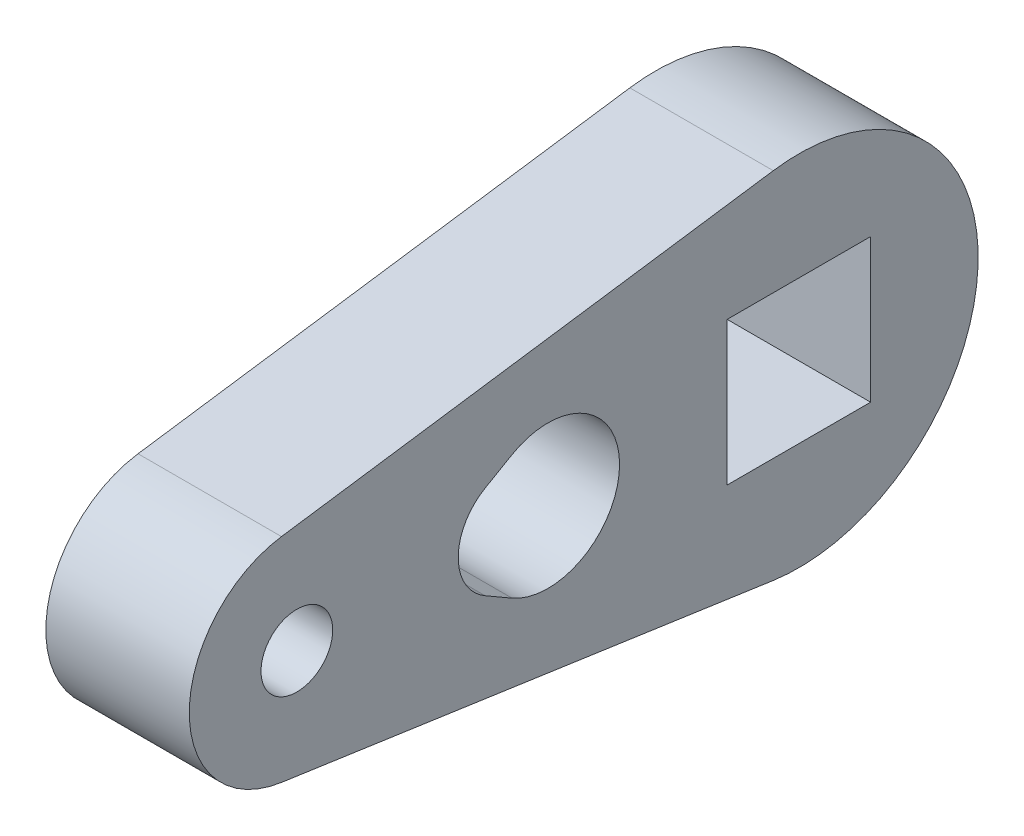
ISO-10303-21;
HEADER;
FILE_DESCRIPTION(('STEP AP214'),'2;1');
FILE_NAME('part.step','',(''),(''),'','','');
FILE_SCHEMA(('AUTOMOTIVE_DESIGN { 1 0 10303 214 1 1 1 1 }'));
ENDSEC;
DATA;
#1=APPLICATION_CONTEXT('core data for automotive mechanical design processes');
#2=APPLICATION_PROTOCOL_DEFINITION('international standard','automotive_design',2000,#1);
#3=PRODUCT_CONTEXT('',#1,'mechanical');
#4=PRODUCT('Part','Part','',(#3));
#5=PRODUCT_RELATED_PRODUCT_CATEGORY('part','',(#4));
#6=PRODUCT_DEFINITION_FORMATION('','',#4);
#7=PRODUCT_DEFINITION_CONTEXT('part definition',#1,'design');
#8=PRODUCT_DEFINITION('design','',#6,#7);
#9=PRODUCT_DEFINITION_SHAPE('','',#8);
#10=(LENGTH_UNIT() NAMED_UNIT(*) SI_UNIT(.MILLI.,.METRE.));
#11=(NAMED_UNIT(*) PLANE_ANGLE_UNIT() SI_UNIT($,.RADIAN.));
#12=(NAMED_UNIT(*) SI_UNIT($,.STERADIAN.) SOLID_ANGLE_UNIT());
#13=UNCERTAINTY_MEASURE_WITH_UNIT(LENGTH_MEASURE(1.E-05),#10,'distance_accuracy_value','');
#14=(GEOMETRIC_REPRESENTATION_CONTEXT(3) GLOBAL_UNCERTAINTY_ASSIGNED_CONTEXT((#13)) GLOBAL_UNIT_ASSIGNED_CONTEXT((#10,
#11,#12)) REPRESENTATION_CONTEXT('',''));
#15=CARTESIAN_POINT('',(0.,0.,0.));
#16=DIRECTION('',(0.,0.,1.));
#17=DIRECTION('',(1.,0.,0.));
#18=AXIS2_PLACEMENT_3D('',#15,#16,#17);
#19=CARTESIAN_POINT('',(4.,0.,28.));
#20=DIRECTION('',(1.,0.,0.));
#21=DIRECTION('',(0.,0.,-1.));
#22=AXIS2_PLACEMENT_3D('',#19,#20,#21);
#23=PLANE('',#22);
#24=DIRECTION('',(0.,-0.500000000000002,-0.866025403784437));
#25=VECTOR('',#24,1.);
#26=CARTESIAN_POINT('',(4.,-2.59807621135331,17.5));
#27=LINE('',#26,#25);
#28=CARTESIAN_POINT('',(4.,-2.59807621135331,17.5));
#29=VERTEX_POINT('',#28);
#30=CARTESIAN_POINT('',(4.,-3.46410161513776,16.));
#31=VERTEX_POINT('',#30);
#32=EDGE_CURVE('E131',#29,#31,#27,.T.);
#33=ORIENTED_EDGE('',*,*,#32,.F.);
#34=CARTESIAN_POINT('',(4.,0.,16.));
#35=DIRECTION('',(1.,0.,0.));
#36=DIRECTION('',(0.,0.,-1.));
#37=AXIS2_PLACEMENT_3D('',#34,#35,#36);
#38=CIRCLE('',#37,3.);
#39=CARTESIAN_POINT('',(4.,2.59807621135331,17.5));
#40=VERTEX_POINT('',#39);
#41=EDGE_CURVE('E123',#40,#29,#38,.T.);
#42=ORIENTED_EDGE('',*,*,#41,.F.);
#43=DIRECTION('',(0.,-0.500000000000002,0.866025403784437));
#44=VECTOR('',#43,1.);
#45=CARTESIAN_POINT('',(4.,2.59807621135331,17.5));
#46=LINE('',#45,#44);
#47=CARTESIAN_POINT('',(4.,3.46410161513776,16.));
#48=VERTEX_POINT('',#47);
#49=EDGE_CURVE('E146',#48,#40,#46,.T.);
#50=ORIENTED_EDGE('',*,*,#49,.F.);
#51=CARTESIAN_POINT('',(4.,0.,14.));
#52=DIRECTION('',(1.,0.,0.));
#53=DIRECTION('',(0.,0.,-1.));
#54=AXIS2_PLACEMENT_3D('',#51,#52,#53);
#55=CIRCLE('',#54,4.);
#56=EDGE_CURVE('E144',#31,#48,#55,.T.);
#57=ORIENTED_EDGE('',*,*,#56,.F.);
#58=EDGE_LOOP('',(#33,#42,#50,#57));
#59=FACE_BOUND('',#58,.T.);
#60=DIRECTION('',(0.,0.,-1.));
#61=VECTOR('',#60,1.);
#62=CARTESIAN_POINT('',(4.,-4.,4.));
#63=LINE('',#62,#61);
#64=CARTESIAN_POINT('',(4.,-4.,4.));
#65=VERTEX_POINT('',#64);
#66=CARTESIAN_POINT('',(4.,-4.,-4.));
#67=VERTEX_POINT('',#66);
#68=EDGE_CURVE('E164',#65,#67,#63,.T.);
#69=ORIENTED_EDGE('',*,*,#68,.F.);
#70=DIRECTION('',(0.,-1.,0.));
#71=VECTOR('',#70,1.);
#72=CARTESIAN_POINT('',(4.,4.,4.));
#73=LINE('',#72,#71);
#74=CARTESIAN_POINT('',(4.,4.,4.));
#75=VERTEX_POINT('',#74);
#76=EDGE_CURVE('E162',#75,#65,#73,.T.);
#77=ORIENTED_EDGE('',*,*,#76,.F.);
#78=DIRECTION('',(0.,0.,1.));
#79=VECTOR('',#78,1.);
#80=CARTESIAN_POINT('',(4.,4.,4.));
#81=LINE('',#80,#79);
#82=CARTESIAN_POINT('',(4.,4.,-4.));
#83=VERTEX_POINT('',#82);
#84=EDGE_CURVE('E170',#83,#75,#81,.T.);
#85=ORIENTED_EDGE('',*,*,#84,.F.);
#86=DIRECTION('',(0.,1.,0.));
#87=VECTOR('',#86,1.);
#88=CARTESIAN_POINT('',(4.,4.,-4.));
#89=LINE('',#88,#87);
#90=EDGE_CURVE('E167',#67,#83,#89,.T.);
#91=ORIENTED_EDGE('',*,*,#90,.F.);
#92=EDGE_LOOP('',(#69,#77,#85,#91));
#93=FACE_BOUND('',#92,.T.);
#94=CARTESIAN_POINT('',(4.,0.,28.));
#95=DIRECTION('',(1.,0.,0.));
#96=DIRECTION('',(0.,0.,-1.));
#97=AXIS2_PLACEMENT_3D('',#94,#95,#96);
#98=CIRCLE('',#97,6.);
#99=CARTESIAN_POINT('',(4.,5.93845991166472,28.8571428571429));
#100=VERTEX_POINT('',#99);
#101=CARTESIAN_POINT('',(4.,-5.93845991166472,28.8571428571429));
#102=VERTEX_POINT('',#101);
#103=EDGE_CURVE('E193',#100,#102,#98,.T.);
#104=ORIENTED_EDGE('',*,*,#103,.T.);
#105=DIRECTION('',(0.,-0.142857142857143,-0.989743318610787));
#106=VECTOR('',#105,1.);
#107=CARTESIAN_POINT('',(4.,-5.93845991166472,28.8571428571429));
#108=LINE('',#107,#106);
#109=CARTESIAN_POINT('',(4.,-9.89743318610787,1.42857142857143));
#110=VERTEX_POINT('',#109);
#111=EDGE_CURVE('E196',#102,#110,#108,.T.);
#112=ORIENTED_EDGE('',*,*,#111,.T.);
#113=CARTESIAN_POINT('',(4.,0.,0.));
#114=DIRECTION('',(1.,0.,0.));
#115=DIRECTION('',(0.,0.,-1.));
#116=AXIS2_PLACEMENT_3D('',#113,#114,#115);
#117=CIRCLE('',#116,10.);
#118=CARTESIAN_POINT('',(4.,9.89743318610787,1.42857142857143));
#119=VERTEX_POINT('',#118);
#120=EDGE_CURVE('E199',#110,#119,#117,.T.);
#121=ORIENTED_EDGE('',*,*,#120,.T.);
#122=DIRECTION('',(0.,-0.142857142857143,0.989743318610787));
#123=VECTOR('',#122,1.);
#124=CARTESIAN_POINT('',(4.,5.93845991166472,28.8571428571429));
#125=LINE('',#124,#123);
#126=EDGE_CURVE('E201',#119,#100,#125,.T.);
#127=ORIENTED_EDGE('',*,*,#126,.T.);
#128=EDGE_LOOP('',(#104,#112,#121,#127));
#129=FACE_BOUND('',#128,.T.);
#130=CARTESIAN_POINT('',(4.,0.,28.));
#131=DIRECTION('',(1.,0.,0.));
#132=DIRECTION('',(0.,0.,-1.));
#133=AXIS2_PLACEMENT_3D('',#130,#131,#132);
#134=CIRCLE('',#133,2.);
#135=CARTESIAN_POINT('',(4.,0.,26.));
#136=VERTEX_POINT('',#135);
#137=EDGE_CURVE('E152',#136,#136,#134,.T.);
#138=ORIENTED_EDGE('',*,*,#137,.F.);
#139=EDGE_LOOP('',(#138));
#140=FACE_BOUND('',#139,.T.);
#141=ADVANCED_FACE('F34',(#59,#93,#129,#140),#23,.T.);
#142=CARTESIAN_POINT('',(-4.,0.,28.));
#143=DIRECTION('',(1.,0.,0.));
#144=DIRECTION('',(0.,0.,-1.));
#145=AXIS2_PLACEMENT_3D('',#142,#143,#144);
#146=PLANE('',#145);
#147=DIRECTION('',(0.,-1.,0.));
#148=VECTOR('',#147,1.);
#149=CARTESIAN_POINT('',(-4.,4.,4.));
#150=LINE('',#149,#148);
#151=CARTESIAN_POINT('',(-4.,4.,4.));
#152=VERTEX_POINT('',#151);
#153=CARTESIAN_POINT('',(-4.,-4.,4.));
#154=VERTEX_POINT('',#153);
#155=EDGE_CURVE('E139',#152,#154,#150,.T.);
#156=ORIENTED_EDGE('',*,*,#155,.T.);
#157=DIRECTION('',(0.,0.,-1.));
#158=VECTOR('',#157,1.);
#159=CARTESIAN_POINT('',(-4.,-4.,4.));
#160=LINE('',#159,#158);
#161=CARTESIAN_POINT('',(-4.,-4.,-4.));
#162=VERTEX_POINT('',#161);
#163=EDGE_CURVE('E175',#154,#162,#160,.T.);
#164=ORIENTED_EDGE('',*,*,#163,.T.);
#165=DIRECTION('',(0.,1.,0.));
#166=VECTOR('',#165,1.);
#167=CARTESIAN_POINT('',(-4.,4.,-4.));
#168=LINE('',#167,#166);
#169=CARTESIAN_POINT('',(-4.,4.,-4.));
#170=VERTEX_POINT('',#169);
#171=EDGE_CURVE('E178',#162,#170,#168,.T.);
#172=ORIENTED_EDGE('',*,*,#171,.T.);
#173=DIRECTION('',(0.,0.,1.));
#174=VECTOR('',#173,1.);
#175=CARTESIAN_POINT('',(-4.,4.,4.));
#176=LINE('',#175,#174);
#177=EDGE_CURVE('E165',#170,#152,#176,.T.);
#178=ORIENTED_EDGE('',*,*,#177,.T.);
#179=EDGE_LOOP('',(#156,#164,#172,#178));
#180=FACE_BOUND('',#179,.T.);
#181=CARTESIAN_POINT('',(-4.,0.,28.));
#182=DIRECTION('',(1.,0.,0.));
#183=DIRECTION('',(0.,0.,-1.));
#184=AXIS2_PLACEMENT_3D('',#181,#182,#183);
#185=CIRCLE('',#184,6.);
#186=CARTESIAN_POINT('',(-4.,5.93845991166472,28.8571428571429));
#187=VERTEX_POINT('',#186);
#188=CARTESIAN_POINT('',(-4.,-5.93845991166472,28.8571428571429));
#189=VERTEX_POINT('',#188);
#190=EDGE_CURVE('E192',#187,#189,#185,.T.);
#191=ORIENTED_EDGE('',*,*,#190,.F.);
#192=DIRECTION('',(0.,-0.142857142857143,0.989743318610787));
#193=VECTOR('',#192,1.);
#194=CARTESIAN_POINT('',(-4.,5.93845991166472,28.8571428571429));
#195=LINE('',#194,#193);
#196=CARTESIAN_POINT('',(-4.,9.89743318610787,1.42857142857143));
#197=VERTEX_POINT('',#196);
#198=EDGE_CURVE('E197',#197,#187,#195,.T.);
#199=ORIENTED_EDGE('',*,*,#198,.F.);
#200=CARTESIAN_POINT('',(-4.,0.,0.));
#201=DIRECTION('',(1.,0.,0.));
#202=DIRECTION('',(0.,0.,-1.));
#203=AXIS2_PLACEMENT_3D('',#200,#201,#202);
#204=CIRCLE('',#203,10.);
#205=CARTESIAN_POINT('',(-4.,-9.89743318610787,1.42857142857143));
#206=VERTEX_POINT('',#205);
#207=EDGE_CURVE('E208',#206,#197,#204,.T.);
#208=ORIENTED_EDGE('',*,*,#207,.F.);
#209=DIRECTION('',(0.,-0.142857142857143,-0.989743318610787));
#210=VECTOR('',#209,1.);
#211=CARTESIAN_POINT('',(-4.,-5.93845991166472,28.8571428571429));
#212=LINE('',#211,#210);
#213=EDGE_CURVE('E206',#189,#206,#212,.T.);
#214=ORIENTED_EDGE('',*,*,#213,.F.);
#215=EDGE_LOOP('',(#191,#199,#208,#214));
#216=FACE_BOUND('',#215,.T.);
#217=CARTESIAN_POINT('',(-4.,0.,16.));
#218=DIRECTION('',(1.,0.,0.));
#219=DIRECTION('',(0.,0.,-1.));
#220=AXIS2_PLACEMENT_3D('',#217,#218,#219);
#221=CIRCLE('',#220,3.);
#222=CARTESIAN_POINT('',(-4.,2.59807621135331,17.5));
#223=VERTEX_POINT('',#222);
#224=CARTESIAN_POINT('',(-4.,-2.59807621135331,17.5));
#225=VERTEX_POINT('',#224);
#226=EDGE_CURVE('E57',#223,#225,#221,.T.);
#227=ORIENTED_EDGE('',*,*,#226,.T.);
#228=DIRECTION('',(0.,-0.500000000000002,-0.866025403784437));
#229=VECTOR('',#228,1.);
#230=CARTESIAN_POINT('',(-4.,-2.59807621135331,17.5));
#231=LINE('',#230,#229);
#232=CARTESIAN_POINT('',(-4.,-3.46410161513776,16.));
#233=VERTEX_POINT('',#232);
#234=EDGE_CURVE('E138',#225,#233,#231,.T.);
#235=ORIENTED_EDGE('',*,*,#234,.T.);
#236=CARTESIAN_POINT('',(-4.,0.,14.));
#237=DIRECTION('',(1.,0.,0.));
#238=DIRECTION('',(0.,0.,-1.));
#239=AXIS2_PLACEMENT_3D('',#236,#237,#238);
#240=CIRCLE('',#239,4.);
#241=CARTESIAN_POINT('',(-4.,3.46410161513776,16.));
#242=VERTEX_POINT('',#241);
#243=EDGE_CURVE('E154',#233,#242,#240,.T.);
#244=ORIENTED_EDGE('',*,*,#243,.T.);
#245=DIRECTION('',(0.,-0.500000000000002,0.866025403784437));
#246=VECTOR('',#245,1.);
#247=CARTESIAN_POINT('',(-4.,2.59807621135331,17.5));
#248=LINE('',#247,#246);
#249=EDGE_CURVE('E132',#242,#223,#248,.T.);
#250=ORIENTED_EDGE('',*,*,#249,.T.);
#251=EDGE_LOOP('',(#227,#235,#244,#250));
#252=FACE_BOUND('',#251,.T.);
#253=CARTESIAN_POINT('',(-4.,0.,28.));
#254=DIRECTION('',(1.,0.,0.));
#255=DIRECTION('',(0.,0.,-1.));
#256=AXIS2_PLACEMENT_3D('',#253,#254,#255);
#257=CIRCLE('',#256,2.);
#258=CARTESIAN_POINT('',(-4.,0.,26.));
#259=VERTEX_POINT('',#258);
#260=EDGE_CURVE('E306',#259,#259,#257,.T.);
#261=ORIENTED_EDGE('',*,*,#260,.T.);
#262=EDGE_LOOP('',(#261));
#263=FACE_BOUND('',#262,.T.);
#264=ADVANCED_FACE('F226',(#180,#216,#252,#263),#146,.F.);
#265=CARTESIAN_POINT('',(4.,0.,28.));
#266=DIRECTION('',(-1.,0.,0.));
#267=DIRECTION('',(0.,0.,1.));
#268=AXIS2_PLACEMENT_3D('',#265,#266,#267);
#269=CYLINDRICAL_SURFACE('',#268,6.);
#270=ORIENTED_EDGE('',*,*,#190,.T.);
#271=DIRECTION('',(-1.,0.,0.));
#272=VECTOR('',#271,1.);
#273=CARTESIAN_POINT('',(4.,-5.93845991166472,28.8571428571429));
#274=LINE('',#273,#272);
#275=EDGE_CURVE('E11',#102,#189,#274,.T.);
#276=ORIENTED_EDGE('',*,*,#275,.F.);
#277=ORIENTED_EDGE('',*,*,#103,.F.);
#278=DIRECTION('',(-1.,0.,0.));
#279=VECTOR('',#278,1.);
#280=CARTESIAN_POINT('',(4.,5.93845991166472,28.8571428571429));
#281=LINE('',#280,#279);
#282=EDGE_CURVE('E203',#100,#187,#281,.T.);
#283=ORIENTED_EDGE('',*,*,#282,.T.);
#284=EDGE_LOOP('',(#270,#276,#277,#283));
#285=FACE_BOUND('',#284,.T.);
#286=ADVANCED_FACE('F36',(#285),#269,.T.);
#287=CARTESIAN_POINT('',(4.,-5.93845991166472,28.8571428571429));
#288=DIRECTION('',(0.,0.989743318610787,-0.142857142857143));
#289=DIRECTION('',(0.,0.142857142857143,0.989743318610787));
#290=AXIS2_PLACEMENT_3D('',#287,#288,#289);
#291=PLANE('',#290);
#292=ORIENTED_EDGE('',*,*,#213,.T.);
#293=DIRECTION('',(-1.,0.,0.));
#294=VECTOR('',#293,1.);
#295=CARTESIAN_POINT('',(4.,-9.89743318610787,1.42857142857143));
#296=LINE('',#295,#294);
#297=EDGE_CURVE('E42',#110,#206,#296,.T.);
#298=ORIENTED_EDGE('',*,*,#297,.F.);
#299=ORIENTED_EDGE('',*,*,#111,.F.);
#300=ORIENTED_EDGE('',*,*,#275,.T.);
#301=EDGE_LOOP('',(#292,#298,#299,#300));
#302=FACE_BOUND('',#301,.T.);
#303=ADVANCED_FACE('F237',(#302),#291,.F.);
#304=CARTESIAN_POINT('',(4.,0.,0.));
#305=DIRECTION('',(-1.,0.,0.));
#306=DIRECTION('',(0.,0.,1.));
#307=AXIS2_PLACEMENT_3D('',#304,#305,#306);
#308=CYLINDRICAL_SURFACE('',#307,10.);
#309=ORIENTED_EDGE('',*,*,#207,.T.);
#310=DIRECTION('',(-1.,0.,0.));
#311=VECTOR('',#310,1.);
#312=CARTESIAN_POINT('',(4.,9.89743318610787,1.42857142857143));
#313=LINE('',#312,#311);
#314=EDGE_CURVE('E213',#119,#197,#313,.T.);
#315=ORIENTED_EDGE('',*,*,#314,.F.);
#316=ORIENTED_EDGE('',*,*,#120,.F.);
#317=ORIENTED_EDGE('',*,*,#297,.T.);
#318=EDGE_LOOP('',(#309,#315,#316,#317));
#319=FACE_BOUND('',#318,.T.);
#320=ADVANCED_FACE('F220',(#319),#308,.T.);
#321=CARTESIAN_POINT('',(4.,5.93845991166472,28.8571428571429));
#322=DIRECTION('',(0.,-0.989743318610787,-0.142857142857143));
#323=DIRECTION('',(0.,0.142857142857143,-0.989743318610787));
#324=AXIS2_PLACEMENT_3D('',#321,#322,#323);
#325=PLANE('',#324);
#326=ORIENTED_EDGE('',*,*,#198,.T.);
#327=ORIENTED_EDGE('',*,*,#282,.F.);
#328=ORIENTED_EDGE('',*,*,#126,.F.);
#329=ORIENTED_EDGE('',*,*,#314,.T.);
#330=EDGE_LOOP('',(#326,#327,#328,#329));
#331=FACE_BOUND('',#330,.T.);
#332=ADVANCED_FACE('F230',(#331),#325,.F.);
#333=CARTESIAN_POINT('',(4.,4.,4.));
#334=DIRECTION('',(0.,0.,-1.));
#335=DIRECTION('',(-1.,0.,0.));
#336=AXIS2_PLACEMENT_3D('',#333,#334,#335);
#337=PLANE('',#336);
#338=ORIENTED_EDGE('',*,*,#155,.F.);
#339=DIRECTION('',(-1.,0.,0.));
#340=VECTOR('',#339,1.);
#341=CARTESIAN_POINT('',(4.,4.,4.));
#342=LINE('',#341,#340);
#343=EDGE_CURVE('E172',#75,#152,#342,.T.);
#344=ORIENTED_EDGE('',*,*,#343,.F.);
#345=ORIENTED_EDGE('',*,*,#76,.T.);
#346=DIRECTION('',(-1.,0.,0.));
#347=VECTOR('',#346,1.);
#348=CARTESIAN_POINT('',(4.,-4.,4.));
#349=LINE('',#348,#347);
#350=EDGE_CURVE('E189',#65,#154,#349,.T.);
#351=ORIENTED_EDGE('',*,*,#350,.T.);
#352=EDGE_LOOP('',(#338,#344,#345,#351));
#353=FACE_BOUND('',#352,.T.);
#354=ADVANCED_FACE('F252',(#353),#337,.T.);
#355=CARTESIAN_POINT('',(4.,-4.,4.));
#356=DIRECTION('',(0.,1.,0.));
#357=DIRECTION('',(0.,0.,1.));
#358=AXIS2_PLACEMENT_3D('',#355,#356,#357);
#359=PLANE('',#358);
#360=ORIENTED_EDGE('',*,*,#163,.F.);
#361=ORIENTED_EDGE('',*,*,#350,.F.);
#362=ORIENTED_EDGE('',*,*,#68,.T.);
#363=DIRECTION('',(-1.,0.,0.));
#364=VECTOR('',#363,1.);
#365=CARTESIAN_POINT('',(4.,-4.,-4.));
#366=LINE('',#365,#364);
#367=EDGE_CURVE('E187',#67,#162,#366,.T.);
#368=ORIENTED_EDGE('',*,*,#367,.T.);
#369=EDGE_LOOP('',(#360,#361,#362,#368));
#370=FACE_BOUND('',#369,.T.);
#371=ADVANCED_FACE('F259',(#370),#359,.T.);
#372=CARTESIAN_POINT('',(4.,4.,-4.));
#373=DIRECTION('',(0.,0.,1.));
#374=DIRECTION('',(1.,0.,0.));
#375=AXIS2_PLACEMENT_3D('',#372,#373,#374);
#376=PLANE('',#375);
#377=ORIENTED_EDGE('',*,*,#171,.F.);
#378=ORIENTED_EDGE('',*,*,#367,.F.);
#379=ORIENTED_EDGE('',*,*,#90,.T.);
#380=DIRECTION('',(-1.,0.,0.));
#381=VECTOR('',#380,1.);
#382=CARTESIAN_POINT('',(4.,4.,-4.));
#383=LINE('',#382,#381);
#384=EDGE_CURVE('E185',#83,#170,#383,.T.);
#385=ORIENTED_EDGE('',*,*,#384,.T.);
#386=EDGE_LOOP('',(#377,#378,#379,#385));
#387=FACE_BOUND('',#386,.T.);
#388=ADVANCED_FACE('F264',(#387),#376,.T.);
#389=CARTESIAN_POINT('',(4.,4.,4.));
#390=DIRECTION('',(0.,-1.,0.));
#391=DIRECTION('',(0.,0.,-1.));
#392=AXIS2_PLACEMENT_3D('',#389,#390,#391);
#393=PLANE('',#392);
#394=ORIENTED_EDGE('',*,*,#177,.F.);
#395=ORIENTED_EDGE('',*,*,#384,.F.);
#396=ORIENTED_EDGE('',*,*,#84,.T.);
#397=ORIENTED_EDGE('',*,*,#343,.T.);
#398=EDGE_LOOP('',(#394,#395,#396,#397));
#399=FACE_BOUND('',#398,.T.);
#400=ADVANCED_FACE('F271',(#399),#393,.T.);
#401=CARTESIAN_POINT('',(4.,0.,16.));
#402=DIRECTION('',(-1.,0.,0.));
#403=DIRECTION('',(0.,0.,1.));
#404=AXIS2_PLACEMENT_3D('',#401,#402,#403);
#405=CYLINDRICAL_SURFACE('',#404,3.);
#406=ORIENTED_EDGE('',*,*,#226,.F.);
#407=DIRECTION('',(-1.,0.,0.));
#408=VECTOR('',#407,1.);
#409=CARTESIAN_POINT('',(4.,2.59807621135331,17.5));
#410=LINE('',#409,#408);
#411=EDGE_CURVE('E127',#40,#223,#410,.T.);
#412=ORIENTED_EDGE('',*,*,#411,.F.);
#413=ORIENTED_EDGE('',*,*,#41,.T.);
#414=DIRECTION('',(-1.,0.,0.));
#415=VECTOR('',#414,1.);
#416=CARTESIAN_POINT('',(4.,-2.59807621135331,17.5));
#417=LINE('',#416,#415);
#418=EDGE_CURVE('E126',#29,#225,#417,.T.);
#419=ORIENTED_EDGE('',*,*,#418,.T.);
#420=EDGE_LOOP('',(#406,#412,#413,#419));
#421=FACE_BOUND('',#420,.T.);
#422=ADVANCED_FACE('F125',(#421),#405,.F.);
#423=CARTESIAN_POINT('',(4.,-2.59807621135331,17.5));
#424=DIRECTION('',(0.,0.866025403784437,-0.500000000000002));
#425=DIRECTION('',(0.,0.500000000000002,0.866025403784437));
#426=AXIS2_PLACEMENT_3D('',#423,#424,#425);
#427=PLANE('',#426);
#428=ORIENTED_EDGE('',*,*,#234,.F.);
#429=ORIENTED_EDGE('',*,*,#418,.F.);
#430=ORIENTED_EDGE('',*,*,#32,.T.);
#431=DIRECTION('',(-1.,0.,0.));
#432=VECTOR('',#431,1.);
#433=CARTESIAN_POINT('',(4.,-3.46410161513776,16.));
#434=LINE('',#433,#432);
#435=EDGE_CURVE('E140',#31,#233,#434,.T.);
#436=ORIENTED_EDGE('',*,*,#435,.T.);
#437=EDGE_LOOP('',(#428,#429,#430,#436));
#438=FACE_BOUND('',#437,.T.);
#439=ADVANCED_FACE('F135',(#438),#427,.T.);
#440=CARTESIAN_POINT('',(4.,0.,14.));
#441=DIRECTION('',(-1.,0.,0.));
#442=DIRECTION('',(0.,0.,1.));
#443=AXIS2_PLACEMENT_3D('',#440,#441,#442);
#444=CYLINDRICAL_SURFACE('',#443,4.);
#445=ORIENTED_EDGE('',*,*,#243,.F.);
#446=ORIENTED_EDGE('',*,*,#435,.F.);
#447=ORIENTED_EDGE('',*,*,#56,.T.);
#448=DIRECTION('',(-1.,0.,0.));
#449=VECTOR('',#448,1.);
#450=CARTESIAN_POINT('',(4.,3.46410161513776,16.));
#451=LINE('',#450,#449);
#452=EDGE_CURVE('E49',#48,#242,#451,.T.);
#453=ORIENTED_EDGE('',*,*,#452,.T.);
#454=EDGE_LOOP('',(#445,#446,#447,#453));
#455=FACE_BOUND('',#454,.T.);
#456=ADVANCED_FACE('F289',(#455),#444,.F.);
#457=CARTESIAN_POINT('',(4.,2.59807621135331,17.5));
#458=DIRECTION('',(0.,-0.866025403784437,-0.500000000000002));
#459=DIRECTION('',(0.,0.500000000000002,-0.866025403784437));
#460=AXIS2_PLACEMENT_3D('',#457,#458,#459);
#461=PLANE('',#460);
#462=ORIENTED_EDGE('',*,*,#249,.F.);
#463=ORIENTED_EDGE('',*,*,#452,.F.);
#464=ORIENTED_EDGE('',*,*,#49,.T.);
#465=ORIENTED_EDGE('',*,*,#411,.T.);
#466=EDGE_LOOP('',(#462,#463,#464,#465));
#467=FACE_BOUND('',#466,.T.);
#468=ADVANCED_FACE('F292',(#467),#461,.T.);
#469=CARTESIAN_POINT('',(4.,0.,28.));
#470=DIRECTION('',(-1.,0.,0.));
#471=DIRECTION('',(0.,0.,1.));
#472=AXIS2_PLACEMENT_3D('',#469,#470,#471);
#473=CYLINDRICAL_SURFACE('',#472,2.);
#474=ORIENTED_EDGE('',*,*,#137,.T.);
#475=EDGE_LOOP('',(#474));
#476=FACE_BOUND('',#475,.T.);
#477=ORIENTED_EDGE('',*,*,#260,.F.);
#478=EDGE_LOOP('',(#477));
#479=FACE_BOUND('',#478,.T.);
#480=ADVANCED_FACE('F296',(#476,#479),#473,.F.);
#481=CLOSED_SHELL('',(#141,#264,#286,#303,#320,#332,#354,#371,#388,#400,#422,#439,#456,#468,#480));
#482=MANIFOLD_SOLID_BREP('B2',#481);
#483=ADVANCED_BREP_SHAPE_REPRESENTATION('',(#18,#482),#14);
#484=SHAPE_DEFINITION_REPRESENTATION(#9,#483);
ENDSEC;
END-ISO-10303-21;
